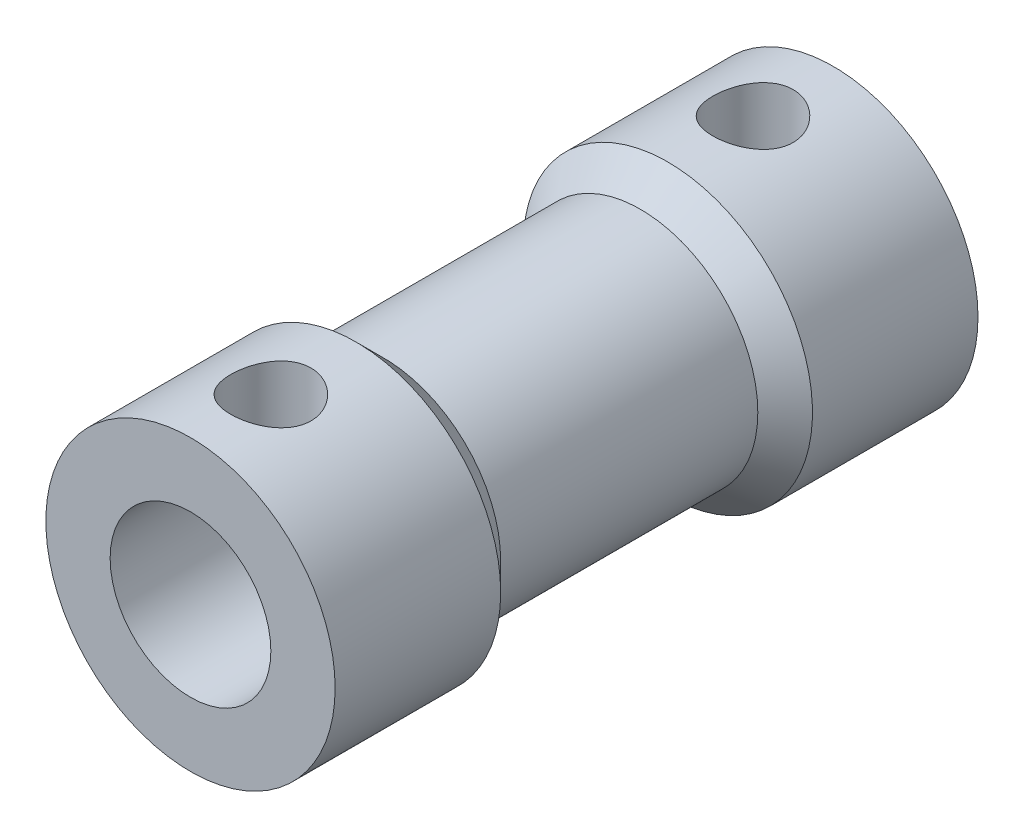
ISO-10303-21;
HEADER;
FILE_DESCRIPTION(('STEP AP214'),'2;1');
FILE_NAME('part.step','',(''),(''),'','','');
FILE_SCHEMA(('AUTOMOTIVE_DESIGN { 1 0 10303 214 1 1 1 1 }'));
ENDSEC;
DATA;
#1=APPLICATION_CONTEXT('core data for automotive mechanical design processes');
#2=APPLICATION_PROTOCOL_DEFINITION('international standard','automotive_design',2000,#1);
#3=PRODUCT_CONTEXT('',#1,'mechanical');
#4=PRODUCT('Part','Part','',(#3));
#5=PRODUCT_RELATED_PRODUCT_CATEGORY('part','',(#4));
#6=PRODUCT_DEFINITION_FORMATION('','',#4);
#7=PRODUCT_DEFINITION_CONTEXT('part definition',#1,'design');
#8=PRODUCT_DEFINITION('design','',#6,#7);
#9=PRODUCT_DEFINITION_SHAPE('','',#8);
#10=(LENGTH_UNIT() NAMED_UNIT(*) SI_UNIT(.MILLI.,.METRE.));
#11=(NAMED_UNIT(*) PLANE_ANGLE_UNIT() SI_UNIT($,.RADIAN.));
#12=(NAMED_UNIT(*) SI_UNIT($,.STERADIAN.) SOLID_ANGLE_UNIT());
#13=UNCERTAINTY_MEASURE_WITH_UNIT(LENGTH_MEASURE(1.E-05),#10,'distance_accuracy_value','');
#14=(GEOMETRIC_REPRESENTATION_CONTEXT(3) GLOBAL_UNCERTAINTY_ASSIGNED_CONTEXT((#13)) GLOBAL_UNIT_ASSIGNED_CONTEXT((#10,
#11,#12)) REPRESENTATION_CONTEXT('',''));
#15=CARTESIAN_POINT('',(0.,0.,0.));
#16=DIRECTION('',(0.,0.,1.));
#17=DIRECTION('',(1.,0.,0.));
#18=AXIS2_PLACEMENT_3D('',#15,#16,#17);
#19=CARTESIAN_POINT('',(0.,0.,5.));
#20=DIRECTION('',(0.,0.,-1.));
#21=DIRECTION('',(-1.,0.,0.));
#22=AXIS2_PLACEMENT_3D('',#19,#20,#21);
#23=CYLINDRICAL_SURFACE('',#22,4.5);
#24=CARTESIAN_POINT('',(0.,4.5,3.74999999999999));
#25=CARTESIAN_POINT('',(-0.0688012508831787,4.49999908016929,3.74999860041476));
#26=CARTESIAN_POINT('',(-0.137617123752666,4.49840674086833,3.7443006801947));
#27=CARTESIAN_POINT('',(-0.273259475994237,4.49220950198236,3.72170427173467));
#28=CARTESIAN_POINT('',(-0.340085103663437,4.48760333149253,3.70480105828627));
#29=CARTESIAN_POINT('',(-0.469769949680299,4.47588565394594,3.66039128058607));
#30=CARTESIAN_POINT('',(-0.532634390095666,4.46877753030964,3.63289903130158));
#31=CARTESIAN_POINT('',(-0.652860695241768,4.45280312581996,3.56814649367313));
#32=CARTESIAN_POINT('',(-0.710222070812293,4.44393668888688,3.53088533808074));
#33=CARTESIAN_POINT('',(-0.819246784715919,4.4251515781749,3.44667056615713));
#34=CARTESIAN_POINT('',(-0.870753112808469,4.41521373623696,3.39951796031245));
#35=CARTESIAN_POINT('',(-0.965238185696333,4.39552607117256,3.2972837228784));
#36=CARTESIAN_POINT('',(-1.00821573084553,4.38577627467018,3.24220097772476));
#37=CARTESIAN_POINT('',(-1.08520808580323,4.36737044294547,3.12439273987068));
#38=CARTESIAN_POINT('',(-1.11903874947837,4.35873847945984,3.06154279155628));
#39=CARTESIAN_POINT('',(-1.17558957131139,4.34382900808304,2.93076808235988));
#40=CARTESIAN_POINT('',(-1.19831197336241,4.33755102474248,2.86284434959184));
#41=CARTESIAN_POINT('',(-1.23144924367955,4.32825883142877,2.72559721114587));
#42=CARTESIAN_POINT('',(-1.24215036904296,4.32516886003199,2.65634817836012));
#43=CARTESIAN_POINT('',(-1.25183427077972,4.32237649384804,2.51697411443717));
#44=CARTESIAN_POINT('',(-1.25081944027302,4.3226734072502,2.4468492651188));
#45=CARTESIAN_POINT('',(-1.23732671337619,4.32655366801454,2.3099777212773));
#46=CARTESIAN_POINT('',(-1.2251990227067,4.33003660668586,2.24319319850379));
#47=CARTESIAN_POINT('',(-1.19038731201904,4.33973517053476,2.11264637140841));
#48=CARTESIAN_POINT('',(-1.16770238457157,4.3459510306134,2.04888432739775));
#49=CARTESIAN_POINT('',(-1.11214373134465,4.36050069775752,1.92529776854472));
#50=CARTESIAN_POINT('',(-1.0791502183699,4.36885918600197,1.86553013318995));
#51=CARTESIAN_POINT('',(-1.00399440679635,4.386739506843,1.75225842440876));
#52=CARTESIAN_POINT('',(-0.961830166290596,4.39626158564316,1.69875568127387));
#53=CARTESIAN_POINT('',(-0.867755610284436,4.41581072126827,1.59753611956359));
#54=CARTESIAN_POINT('',(-0.815552279702351,4.42584370037791,1.55009236512015));
#55=CARTESIAN_POINT('',(-0.703806607201032,4.44498199810829,1.4645742692222));
#56=CARTESIAN_POINT('',(-0.644263925421961,4.45408727373461,1.42650036189753));
#57=CARTESIAN_POINT('',(-0.519083429338111,4.47040839712755,1.36066818436993));
#58=CARTESIAN_POINT('',(-0.453416395747745,4.47761448645532,1.3329628960611));
#59=CARTESIAN_POINT('',(-0.318109988769713,4.48925492501446,1.28906590155864));
#60=CARTESIAN_POINT('',(-0.248471564121129,4.493689933237,1.27287145784344));
#61=CARTESIAN_POINT('',(-0.109526607713141,4.49918736483408,1.25289286322103));
#62=CARTESIAN_POINT('',(-0.0402773058586807,4.5003505382403,1.24873785509284));
#63=CARTESIAN_POINT('',(0.0979299306365669,4.49946480293159,1.25192699829244));
#64=CARTESIAN_POINT('',(0.166887897284518,4.49741625678167,1.25926985164806));
#65=CARTESIAN_POINT('',(0.301206913470859,4.49040265059029,1.28494333411964));
#66=CARTESIAN_POINT('',(0.366611288163866,4.48549337167581,1.30306394505753));
#67=CARTESIAN_POINT('',(0.493443118118719,4.47331829169354,1.3495318676381));
#68=CARTESIAN_POINT('',(0.554870123972379,4.46605222488463,1.37788033256952));
#69=CARTESIAN_POINT('',(0.673420140405413,4.44973740284175,1.4446658780465));
#70=CARTESIAN_POINT('',(0.730427061953538,4.44065471340565,1.48330052432267));
#71=CARTESIAN_POINT('',(0.837277670586996,4.42175477128212,1.56931613580747));
#72=CARTESIAN_POINT('',(0.887119814631371,4.41193736105189,1.61669898006577));
#73=CARTESIAN_POINT('',(0.979812026944947,4.39229842684379,1.72060144387835));
#74=CARTESIAN_POINT('',(1.02239957885382,4.3824860820796,1.77735745155757));
#75=CARTESIAN_POINT('',(1.09745581429007,4.36429693304267,1.89742063787974));
#76=CARTESIAN_POINT('',(1.12992488482463,4.35592007387163,1.9607275658426));
#77=CARTESIAN_POINT('',(1.18358105834153,4.34164798956173,2.09180716988317));
#78=CARTESIAN_POINT('',(1.20483077484782,4.3357390309604,2.15955263775464));
#79=CARTESIAN_POINT('',(1.23557652495356,4.32707876892784,2.29784970941676));
#80=CARTESIAN_POINT('',(1.24507587906572,4.32432657344887,2.36840051463312));
#81=CARTESIAN_POINT('',(1.25184859974321,4.32237038329875,2.50760577949078));
#82=CARTESIAN_POINT('',(1.24954571014581,4.32304340461177,2.57623819001194));
#83=CARTESIAN_POINT('',(1.23377143287258,4.32757137052124,2.71209489379468));
#84=CARTESIAN_POINT('',(1.2203003804941,4.33142621959091,2.77931922926823));
#85=CARTESIAN_POINT('',(1.18282724248614,4.34180718808003,2.90986723391806));
#86=CARTESIAN_POINT('',(1.15892214641117,4.34830866913275,2.97322084264776));
#87=CARTESIAN_POINT('',(1.10133451670734,4.36324916052054,3.09506742250732));
#88=CARTESIAN_POINT('',(1.06765033358687,4.37168849767404,3.15355957148569));
#89=CARTESIAN_POINT('',(0.990206962020966,4.38988810785379,3.26602765282517));
#90=CARTESIAN_POINT('',(0.946162084346261,4.39968178982262,3.31980147668272));
#91=CARTESIAN_POINT('',(0.849781527450658,4.41930831909363,3.41933237205345));
#92=CARTESIAN_POINT('',(0.797443795628186,4.42914117550311,3.46508745289098));
#93=CARTESIAN_POINT('',(0.684460232307877,4.44801839581548,3.54835813657808));
#94=CARTESIAN_POINT('',(0.62364625893217,4.45703841192792,3.58565162331068));
#95=CARTESIAN_POINT('',(0.496361982692838,4.47299974900605,3.64942813928947));
#96=CARTESIAN_POINT('',(0.429895030176722,4.47994229035336,3.67591751858101));
#97=CARTESIAN_POINT('',(0.303145483766698,4.4901607483195,3.71422008073469));
#98=CARTESIAN_POINT('',(0.243364402168739,4.49382245661855,3.72760478759287));
#99=CARTESIAN_POINT('',(0.122392625693408,4.49874234976285,3.74549484582254));
#100=CARTESIAN_POINT('',(0.0612020980194146,4.50000081823468,3.75000124499992));
#101=CARTESIAN_POINT('',(0.,4.5,3.74999999999999));
#102=B_SPLINE_CURVE_WITH_KNOTS('',3,(#24,#25,#26,#27,#28,#29,#30,#31,#32,#33,#34,#35,#36,#37,
#38,#39,#40,#41,#42,#43,#44,#45,#46,#47,#48,#49,#50,#51,#52,#53,#54,#55,#56,#57,#58,#59,#60,#61,
#62,#63,#64,#65,#66,#67,#68,#69,#70,#71,#72,#73,#74,#75,#76,#77,#78,#79,#80,#81,#82,#83,#84,#85,
#86,#87,#88,#89,#90,#91,#92,#93,#94,#95,#96,#97,#98,#99,#100,#101),.UNSPECIFIED.,.T.,.F.,(4,2,2,
2,2,2,2,2,2,2,2,2,2,2,2,2,2,2,2,2,2,2,2,2,2,2,2,2,2,2,2,2,2,2,2,2,2,2,4),(0.,0.206179193099489,
0.412445386147258,0.618433707942851,0.824440322837926,1.03507624325263,1.24574177043995,
1.46037690323671,1.67496866133383,1.88433431939188,2.09365721284143,2.2966023299042,
2.49956489399152,2.70497960040654,2.91043784592673,3.1231949383816,3.33596188658144,
3.54980165635948,3.76359055350005,3.97072010588424,4.17782627748475,4.38102317477484,
4.58424299163036,4.79168948884224,4.99918059600961,5.21305991702848,5.42693105668197,
5.63959564853969,5.85220013017263,6.05722599244304,6.26224569952545,6.46539893556021,
6.66858645848125,6.87821913273767,7.08790377540616,7.30258090584728,7.51713167871714,
7.70055986525025,7.8839664025393),.UNSPECIFIED.);
#103=CARTESIAN_POINT('',(0.,4.5,3.74999999999999));
#104=VERTEX_POINT('',#103);
#105=EDGE_CURVE('E74',#104,#104,#102,.T.);
#106=ORIENTED_EDGE('',*,*,#105,.T.);
#107=EDGE_LOOP('',(#106));
#108=FACE_BOUND('',#107,.T.);
#109=CARTESIAN_POINT('',(0.,0.,5.15000000000001));
#110=DIRECTION('',(0.,0.,-1.));
#111=DIRECTION('',(-1.,0.,0.));
#112=AXIS2_PLACEMENT_3D('',#109,#110,#111);
#113=CIRCLE('',#112,4.5);
#114=CARTESIAN_POINT('',(-4.5,0.,5.15000000000001));
#115=VERTEX_POINT('',#114);
#116=EDGE_CURVE('E93',#115,#115,#113,.T.);
#117=ORIENTED_EDGE('',*,*,#116,.T.);
#118=EDGE_LOOP('',(#117));
#119=FACE_BOUND('',#118,.T.);
#120=CARTESIAN_POINT('',(0.,0.,0.));
#121=DIRECTION('',(0.,0.,1.));
#122=DIRECTION('',(1.,0.,0.));
#123=AXIS2_PLACEMENT_3D('',#120,#121,#122);
#124=CIRCLE('',#123,4.5);
#125=CARTESIAN_POINT('',(4.5,0.,0.));
#126=VERTEX_POINT('',#125);
#127=EDGE_CURVE('E85',#126,#126,#124,.T.);
#128=ORIENTED_EDGE('',*,*,#127,.T.);
#129=EDGE_LOOP('',(#128));
#130=FACE_BOUND('',#129,.T.);
#131=ADVANCED_FACE('F39',(#108,#119,#130),#23,.T.);
#132=CARTESIAN_POINT('',(0.,0.,0.));
#133=DIRECTION('',(0.,0.,1.));
#134=DIRECTION('',(1.,0.,0.));
#135=AXIS2_PLACEMENT_3D('',#132,#133,#134);
#136=PLANE('',#135);
#137=CARTESIAN_POINT('',(0.,0.,0.));
#138=DIRECTION('',(0.,0.,-1.));
#139=DIRECTION('',(-1.,0.,0.));
#140=AXIS2_PLACEMENT_3D('',#137,#138,#139);
#141=CIRCLE('',#140,1.5);
#142=CARTESIAN_POINT('',(-1.5,0.,0.));
#143=VERTEX_POINT('',#142);
#144=EDGE_CURVE('E66',#143,#143,#141,.T.);
#145=ORIENTED_EDGE('',*,*,#144,.F.);
#146=EDGE_LOOP('',(#145));
#147=FACE_BOUND('',#146,.T.);
#148=ORIENTED_EDGE('',*,*,#127,.F.);
#149=EDGE_LOOP('',(#148));
#150=FACE_BOUND('',#149,.T.);
#151=ADVANCED_FACE('F127',(#147,#150),#136,.F.);
#152=CARTESIAN_POINT('',(0.,0.,15.));
#153=DIRECTION('',(0.,0.,-1.));
#154=DIRECTION('',(-1.,0.,0.));
#155=AXIS2_PLACEMENT_3D('',#152,#153,#154);
#156=CYLINDRICAL_SURFACE('',#155,3.65);
#157=CARTESIAN_POINT('',(0.,0.,14.));
#158=DIRECTION('',(0.,0.,1.));
#159=DIRECTION('',(1.,0.,0.));
#160=AXIS2_PLACEMENT_3D('',#157,#158,#159);
#161=CIRCLE('',#160,3.65);
#162=CARTESIAN_POINT('',(3.65,0.,14.));
#163=VERTEX_POINT('',#162);
#164=EDGE_CURVE('E48',#163,#163,#161,.F.);
#165=ORIENTED_EDGE('',*,*,#164,.T.);
#166=EDGE_LOOP('',(#165));
#167=FACE_BOUND('',#166,.T.);
#168=CARTESIAN_POINT('',(0.,0.,6.00000000000002));
#169=DIRECTION('',(0.,0.,1.));
#170=DIRECTION('',(1.,0.,0.));
#171=AXIS2_PLACEMENT_3D('',#168,#169,#170);
#172=CIRCLE('',#171,3.65);
#173=CARTESIAN_POINT('',(3.65,0.,6.00000000000002));
#174=VERTEX_POINT('',#173);
#175=EDGE_CURVE('E89',#174,#174,#172,.T.);
#176=ORIENTED_EDGE('',*,*,#175,.T.);
#177=EDGE_LOOP('',(#176));
#178=FACE_BOUND('',#177,.T.);
#179=ADVANCED_FACE('F100',(#167,#178),#156,.T.);
#180=CARTESIAN_POINT('',(0.,0.,20.));
#181=DIRECTION('',(0.,0.,-1.));
#182=DIRECTION('',(-1.,0.,0.));
#183=AXIS2_PLACEMENT_3D('',#180,#181,#182);
#184=CYLINDRICAL_SURFACE('',#183,4.5);
#185=CARTESIAN_POINT('',(0.,4.5,18.75));
#186=CARTESIAN_POINT('',(-0.0688012508831785,4.49999908016929,18.7499986004148));
#187=CARTESIAN_POINT('',(-0.137617123752666,4.49840674086833,18.7443006801947));
#188=CARTESIAN_POINT('',(-0.273259475994236,4.49220950198236,18.7217042717347));
#189=CARTESIAN_POINT('',(-0.340085103663437,4.48760333149253,18.7048010582863));
#190=CARTESIAN_POINT('',(-0.469769949680299,4.47588565394594,18.6603912805861));
#191=CARTESIAN_POINT('',(-0.532634390095667,4.46877753030964,18.6328990313016));
#192=CARTESIAN_POINT('',(-0.652860695241768,4.45280312581996,18.5681464936731));
#193=CARTESIAN_POINT('',(-0.710222070812293,4.44393668888688,18.5308853380807));
#194=CARTESIAN_POINT('',(-0.819246784715919,4.4251515781749,18.4466705661571));
#195=CARTESIAN_POINT('',(-0.870753112808469,4.41521373623696,18.3995179603125));
#196=CARTESIAN_POINT('',(-0.965238185696333,4.39552607117256,18.2972837228784));
#197=CARTESIAN_POINT('',(-1.00821573084554,4.38577627467018,18.2422009777248));
#198=CARTESIAN_POINT('',(-1.08520808580323,4.36737044294547,18.1243927398707));
#199=CARTESIAN_POINT('',(-1.11903874947837,4.35873847945984,18.0615427915563));
#200=CARTESIAN_POINT('',(-1.17558957131139,4.34382900808304,17.9307680823599));
#201=CARTESIAN_POINT('',(-1.19831197336241,4.33755102474248,17.8628443495918));
#202=CARTESIAN_POINT('',(-1.23144924367955,4.32825883142877,17.7255972111459));
#203=CARTESIAN_POINT('',(-1.24215036904296,4.32516886003198,17.6563481783601));
#204=CARTESIAN_POINT('',(-1.25183427077972,4.32237649384804,17.5169741144372));
#205=CARTESIAN_POINT('',(-1.25081944027302,4.3226734072502,17.4468492651188));
#206=CARTESIAN_POINT('',(-1.23732671337619,4.32655366801454,17.3099777212773));
#207=CARTESIAN_POINT('',(-1.2251990227067,4.33003660668586,17.2431931985038));
#208=CARTESIAN_POINT('',(-1.19038731201904,4.33973517053476,17.1126463714084));
#209=CARTESIAN_POINT('',(-1.16770238457157,4.3459510306134,17.0488843273977));
#210=CARTESIAN_POINT('',(-1.11214373134465,4.36050069775752,16.9252977685447));
#211=CARTESIAN_POINT('',(-1.07915021836991,4.36885918600197,16.86553013319));
#212=CARTESIAN_POINT('',(-1.00399440679635,4.386739506843,16.7522584244088));
#213=CARTESIAN_POINT('',(-0.961830166290598,4.39626158564316,16.6987556812739));
#214=CARTESIAN_POINT('',(-0.867755610284437,4.41581072126827,16.5975361195636));
#215=CARTESIAN_POINT('',(-0.815552279702352,4.42584370037791,16.5500923651202));
#216=CARTESIAN_POINT('',(-0.703806607201032,4.44498199810829,16.4645742692222));
#217=CARTESIAN_POINT('',(-0.644263925421962,4.45408727373461,16.4265003618975));
#218=CARTESIAN_POINT('',(-0.519083429338113,4.47040839712755,16.3606681843699));
#219=CARTESIAN_POINT('',(-0.453416395747746,4.47761448645532,16.3329628960611));
#220=CARTESIAN_POINT('',(-0.318109988769714,4.48925492501446,16.2890659015586));
#221=CARTESIAN_POINT('',(-0.248471564121129,4.493689933237,16.2728714578434));
#222=CARTESIAN_POINT('',(-0.109526607713141,4.49918736483408,16.252892863221));
#223=CARTESIAN_POINT('',(-0.0402773058586806,4.5003505382403,16.2487378550928));
#224=CARTESIAN_POINT('',(0.0979299306365672,4.49946480293159,16.2519269982924));
#225=CARTESIAN_POINT('',(0.166887897284518,4.49741625678167,16.2592698516481));
#226=CARTESIAN_POINT('',(0.301206913470858,4.49040265059029,16.2849433341196));
#227=CARTESIAN_POINT('',(0.366611288163864,4.48549337167581,16.3030639450575));
#228=CARTESIAN_POINT('',(0.493443118118718,4.47331829169354,16.3495318676381));
#229=CARTESIAN_POINT('',(0.554870123972379,4.46605222488463,16.3778803325695));
#230=CARTESIAN_POINT('',(0.673420140405413,4.44973740284175,16.4446658780465));
#231=CARTESIAN_POINT('',(0.730427061953537,4.44065471340565,16.4833005243227));
#232=CARTESIAN_POINT('',(0.837277670586995,4.42175477128212,16.5693161358075));
#233=CARTESIAN_POINT('',(0.887119814631371,4.41193736105189,16.6166989800658));
#234=CARTESIAN_POINT('',(0.979812026944947,4.39229842684379,16.7206014438784));
#235=CARTESIAN_POINT('',(1.02239957885382,4.3824860820796,16.7773574515576));
#236=CARTESIAN_POINT('',(1.09745581429007,4.36429693304267,16.8974206378797));
#237=CARTESIAN_POINT('',(1.12992488482463,4.35592007387163,16.9607275658426));
#238=CARTESIAN_POINT('',(1.18358105834153,4.34164798956173,17.0918071698832));
#239=CARTESIAN_POINT('',(1.20483077484782,4.3357390309604,17.1595526377546));
#240=CARTESIAN_POINT('',(1.23557652495356,4.32707876892784,17.2978497094168));
#241=CARTESIAN_POINT('',(1.24507587906572,4.32432657344887,17.3684005146331));
#242=CARTESIAN_POINT('',(1.25184859974321,4.32237038329875,17.5076057794908));
#243=CARTESIAN_POINT('',(1.24954571014581,4.32304340461177,17.5762381900119));
#244=CARTESIAN_POINT('',(1.23377143287258,4.32757137052124,17.7120948937947));
#245=CARTESIAN_POINT('',(1.2203003804941,4.33142621959091,17.7793192292682));
#246=CARTESIAN_POINT('',(1.18282724248614,4.34180718808003,17.9098672339181));
#247=CARTESIAN_POINT('',(1.15892214641116,4.34830866913275,17.9732208426478));
#248=CARTESIAN_POINT('',(1.10133451670734,4.36324916052054,18.0950674225073));
#249=CARTESIAN_POINT('',(1.06765033358687,4.37168849767404,18.1535595714857));
#250=CARTESIAN_POINT('',(0.990206962020968,4.38988810785379,18.2660276528252));
#251=CARTESIAN_POINT('',(0.946162084346263,4.39968178982262,18.3198014766827));
#252=CARTESIAN_POINT('',(0.84978152745066,4.41930831909363,18.4193323720535));
#253=CARTESIAN_POINT('',(0.797443795628188,4.42914117550311,18.465087452891));
#254=CARTESIAN_POINT('',(0.684460232307879,4.44801839581548,18.5483581365781));
#255=CARTESIAN_POINT('',(0.623646258932172,4.45703841192792,18.5856516233107));
#256=CARTESIAN_POINT('',(0.496361982692839,4.47299974900605,18.6494281392895));
#257=CARTESIAN_POINT('',(0.429895030176723,4.47994229035336,18.675917518581));
#258=CARTESIAN_POINT('',(0.303145483766698,4.4901607483195,18.7142200807347));
#259=CARTESIAN_POINT('',(0.243364402168739,4.49382245661855,18.7276047875929));
#260=CARTESIAN_POINT('',(0.122392625693408,4.49874234976285,18.7454948458225));
#261=CARTESIAN_POINT('',(0.0612020980194147,4.50000081823468,18.7500012449999));
#262=CARTESIAN_POINT('',(0.,4.5,18.75));
#263=B_SPLINE_CURVE_WITH_KNOTS('',3,(#185,#186,#187,#188,#189,#190,#191,#192,#193,#194,#195,
#196,#197,#198,#199,#200,#201,#202,#203,#204,#205,#206,#207,#208,#209,#210,#211,#212,#213,#214,
#215,#216,#217,#218,#219,#220,#221,#222,#223,#224,#225,#226,#227,#228,#229,#230,#231,#232,#233,
#234,#235,#236,#237,#238,#239,#240,#241,#242,#243,#244,#245,#246,#247,#248,#249,#250,#251,#252,
#253,#254,#255,#256,#257,#258,#259,#260,#261,#262),.UNSPECIFIED.,.T.,.F.,(4,2,2,2,2,2,2,2,2,2,2,
2,2,2,2,2,2,2,2,2,2,2,2,2,2,2,2,2,2,2,2,2,2,2,2,2,2,2,4),(0.,0.206179193099489,
0.412445386147258,0.618433707942851,0.824440322837926,1.03507624325264,1.24574177043995,
1.46037690323671,1.67496866133383,1.88433431939188,2.09365721284143,2.29660232990421,
2.49956489399152,2.70497960040654,2.91043784592673,3.1231949383816,3.33596188658144,
3.54980165635947,3.76359055350005,3.97072010588424,4.17782627748475,4.38102317477484,
4.58424299163036,4.79168948884224,4.99918059600961,5.21305991702848,5.42693105668197,
5.63959564853968,5.85220013017264,6.05722599244304,6.26224569952545,6.46539893556021,
6.66858645848125,6.87821913273767,7.08790377540616,7.30258090584728,7.51713167871714,
7.70055986525026,7.8839664025393),.UNSPECIFIED.);
#264=CARTESIAN_POINT('',(0.,4.5,18.75));
#265=VERTEX_POINT('',#264);
#266=EDGE_CURVE('E249',#265,#265,#263,.T.);
#267=ORIENTED_EDGE('',*,*,#266,.T.);
#268=EDGE_LOOP('',(#267));
#269=FACE_BOUND('',#268,.T.);
#270=CARTESIAN_POINT('',(0.,0.,14.85));
#271=DIRECTION('',(0.,0.,1.));
#272=DIRECTION('',(1.,0.,0.));
#273=AXIS2_PLACEMENT_3D('',#270,#271,#272);
#274=CIRCLE('',#273,4.5);
#275=CARTESIAN_POINT('',(4.5,0.,14.85));
#276=VERTEX_POINT('',#275);
#277=EDGE_CURVE('E11',#276,#276,#274,.T.);
#278=ORIENTED_EDGE('',*,*,#277,.T.);
#279=EDGE_LOOP('',(#278));
#280=FACE_BOUND('',#279,.T.);
#281=CARTESIAN_POINT('',(0.,0.,20.));
#282=DIRECTION('',(0.,0.,1.));
#283=DIRECTION('',(1.,0.,0.));
#284=AXIS2_PLACEMENT_3D('',#281,#282,#283);
#285=CIRCLE('',#284,4.5);
#286=CARTESIAN_POINT('',(4.5,0.,20.));
#287=VERTEX_POINT('',#286);
#288=EDGE_CURVE('E81',#287,#287,#285,.T.);
#289=ORIENTED_EDGE('',*,*,#288,.F.);
#290=EDGE_LOOP('',(#289));
#291=FACE_BOUND('',#290,.T.);
#292=ADVANCED_FACE('F109',(#269,#280,#291),#184,.T.);
#293=CARTESIAN_POINT('',(0.,0.,20.));
#294=DIRECTION('',(0.,0.,1.));
#295=DIRECTION('',(1.,0.,0.));
#296=AXIS2_PLACEMENT_3D('',#293,#294,#295);
#297=PLANE('',#296);
#298=CARTESIAN_POINT('',(0.,0.,20.));
#299=DIRECTION('',(0.,0.,1.));
#300=DIRECTION('',(1.,0.,0.));
#301=AXIS2_PLACEMENT_3D('',#298,#299,#300);
#302=CIRCLE('',#301,2.5);
#303=CARTESIAN_POINT('',(2.5,0.,20.));
#304=VERTEX_POINT('',#303);
#305=EDGE_CURVE('E65',#304,#304,#302,.T.);
#306=ORIENTED_EDGE('',*,*,#305,.F.);
#307=EDGE_LOOP('',(#306));
#308=FACE_BOUND('',#307,.T.);
#309=ORIENTED_EDGE('',*,*,#288,.T.);
#310=EDGE_LOOP('',(#309));
#311=FACE_BOUND('',#310,.T.);
#312=ADVANCED_FACE('F112',(#308,#311),#297,.T.);
#313=CARTESIAN_POINT('',(0.,0.,6.00000000000002));
#314=DIRECTION('',(0.,0.,-1.));
#315=DIRECTION('',(-1.,0.,0.));
#316=AXIS2_PLACEMENT_3D('',#313,#314,#315);
#317=CONICAL_SURFACE('',#316,3.65,0.785398163397444);
#318=ORIENTED_EDGE('',*,*,#116,.F.);
#319=EDGE_LOOP('',(#318));
#320=FACE_BOUND('',#319,.T.);
#321=ORIENTED_EDGE('',*,*,#175,.F.);
#322=EDGE_LOOP('',(#321));
#323=FACE_BOUND('',#322,.T.);
#324=ADVANCED_FACE('F106',(#320,#323),#317,.T.);
#325=CARTESIAN_POINT('',(0.,0.,15.));
#326=DIRECTION('',(0.,0.,1.));
#327=DIRECTION('',(1.,0.,0.));
#328=AXIS2_PLACEMENT_3D('',#325,#326,#327);
#329=CONICAL_SURFACE('',#328,4.65000000000002,0.785398163397453);
#330=ORIENTED_EDGE('',*,*,#164,.F.);
#331=EDGE_LOOP('',(#330));
#332=FACE_BOUND('',#331,.T.);
#333=ORIENTED_EDGE('',*,*,#277,.F.);
#334=EDGE_LOOP('',(#333));
#335=FACE_BOUND('',#334,.T.);
#336=ADVANCED_FACE('F41',(#332,#335),#329,.T.);
#337=CARTESIAN_POINT('',(0.,0.,15.));
#338=DIRECTION('',(0.,0.,1.));
#339=DIRECTION('',(1.,0.,0.));
#340=AXIS2_PLACEMENT_3D('',#337,#338,#339);
#341=CONICAL_SURFACE('',#340,2.5,1.02974425867665);
#342=CARTESIAN_POINT('',(0.,0.,13.4978484524311));
#343=VERTEX_POINT('',#342);
#344=VERTEX_LOOP('',#343);
#345=FACE_BOUND('',#344,.T.);
#346=CARTESIAN_POINT('',(0.,0.,15.));
#347=DIRECTION('',(0.,0.,1.));
#348=DIRECTION('',(1.,0.,0.));
#349=AXIS2_PLACEMENT_3D('',#346,#347,#348);
#350=CIRCLE('',#349,2.5);
#351=CARTESIAN_POINT('',(2.5,0.,15.));
#352=VERTEX_POINT('',#351);
#353=EDGE_CURVE('E71',#352,#352,#350,.T.);
#354=ORIENTED_EDGE('',*,*,#353,.T.);
#355=EDGE_LOOP('',(#354));
#356=FACE_BOUND('',#355,.T.);
#357=ADVANCED_FACE('F105',(#345,#356),#341,.F.);
#358=CARTESIAN_POINT('',(0.,0.,20.));
#359=DIRECTION('',(0.,0.,1.));
#360=DIRECTION('',(1.,0.,0.));
#361=AXIS2_PLACEMENT_3D('',#358,#359,#360);
#362=CYLINDRICAL_SURFACE('',#361,2.5);
#363=CARTESIAN_POINT('',(0.,2.5,18.75));
#364=CARTESIAN_POINT('',(0.0657149536912328,2.49999641755189,18.7499958721006));
#365=CARTESIAN_POINT('',(0.13150824962254,2.49738113774397,18.7447874085979));
#366=CARTESIAN_POINT('',(0.26115029408553,2.48717695046745,18.7241838995738));
#367=CARTESIAN_POINT('',(0.324995108391877,2.47957859786229,18.7087695087529));
#368=CARTESIAN_POINT('',(0.448666931100716,2.46020349254139,18.668507739229));
#369=CARTESIAN_POINT('',(0.508508503673973,2.448442989719,18.64369701969));
#370=CARTESIAN_POINT('',(0.623090771008203,2.42182220644723,18.5855367232938));
#371=CARTESIAN_POINT('',(0.677831867487558,2.40696217041913,18.5521878196889));
#372=CARTESIAN_POINT('',(0.784384772202394,2.37445322822571,18.4756034381434));
#373=CARTESIAN_POINT('',(0.835819013902635,2.3566899890942,18.4318919009504));
#374=CARTESIAN_POINT('',(0.930974306083716,2.32074962808431,18.3368481509412));
#375=CARTESIAN_POINT('',(0.974689478883452,2.30257220261294,18.2855101852844));
#376=CARTESIAN_POINT('',(1.05656500056284,2.26623688996684,18.1718958130958));
#377=CARTESIAN_POINT('',(1.09403166943954,2.24818983712665,18.1090798770676));
#378=CARTESIAN_POINT('',(1.15771028361336,2.21607473465401,17.9770408300172));
#379=CARTESIAN_POINT('',(1.18393026870791,2.20200384508737,17.9078223390966));
#380=CARTESIAN_POINT('',(1.22266555273573,2.18072333797261,17.7691686182226));
#381=CARTESIAN_POINT('',(1.23590732135055,2.17315339479642,17.6999944349158));
#382=CARTESIAN_POINT('',(1.25053374163605,2.1647736243566,17.5600264527757));
#383=CARTESIAN_POINT('',(1.25193011046634,2.1639571167911,17.4892343239111));
#384=CARTESIAN_POINT('',(1.24335910896536,2.16888662821561,17.3571424696058));
#385=CARTESIAN_POINT('',(1.23473069942102,2.17385954577517,17.2957199609712));
#386=CARTESIAN_POINT('',(1.20867481132116,2.18845285917313,17.1753476132837));
#387=CARTESIAN_POINT('',(1.19124452987206,2.19807473539721,17.1163985683684));
#388=CARTESIAN_POINT('',(1.1477622254825,2.22109345515927,17.0009635842929));
#389=CARTESIAN_POINT('',(1.12151883389499,2.23457300829998,16.9445670015178));
#390=CARTESIAN_POINT('',(1.061302109585,2.26379255351755,16.8367071342625));
#391=CARTESIAN_POINT('',(1.02732530476558,2.27953355975239,16.7852460804999));
#392=CARTESIAN_POINT('',(0.947582568640979,2.31391447379107,16.681848434071));
#393=CARTESIAN_POINT('',(0.900868072961596,2.33266887795933,16.6306789080298));
#394=CARTESIAN_POINT('',(0.799444473426711,2.36934529125509,16.5365807267614));
#395=CARTESIAN_POINT('',(0.744731570717851,2.38726689948501,16.4936560099577));
#396=CARTESIAN_POINT('',(0.625645632289805,2.42127484103705,16.4153929237128));
#397=CARTESIAN_POINT('',(0.560941989499256,2.43723730202509,16.3804994094428));
#398=CARTESIAN_POINT('',(0.425582769360991,2.46447351401553,16.3223787136962));
#399=CARTESIAN_POINT('',(0.354931970331591,2.47575098679441,16.299142268731));
#400=CARTESIAN_POINT('',(0.215958114575873,2.49155417176795,16.2669057453542));
#401=CARTESIAN_POINT('',(0.147926913185402,2.4965617287664,16.2568859553165));
#402=CARTESIAN_POINT('',(0.0109744999366897,2.50091266823877,16.2481690860819));
#403=CARTESIAN_POINT('',(-0.0579462748373788,2.5002587340164,16.2494666429507));
#404=CARTESIAN_POINT('',(-0.189041214982493,2.49363990316801,16.2627583605234));
#405=CARTESIAN_POINT('',(-0.251324260062443,2.48809057110237,16.2739156659125));
#406=CARTESIAN_POINT('',(-0.373008615377396,2.47277714143524,16.3052975898689));
#407=CARTESIAN_POINT('',(-0.432409607113746,2.46301257917916,16.3255232080667));
#408=CARTESIAN_POINT('',(-0.548610760562082,2.43980314267087,16.3749980830415));
#409=CARTESIAN_POINT('',(-0.605287996257693,2.42626102212424,16.404488812646));
#410=CARTESIAN_POINT('',(-0.713076702123651,2.39679967896386,16.4713844195576));
#411=CARTESIAN_POINT('',(-0.764185787219101,2.38087944457231,16.5087926682418));
#412=CARTESIAN_POINT('',(-0.864709611613314,2.34635276671831,16.5947005316661));
#413=CARTESIAN_POINT('',(-0.913465097280795,2.32763606060552,16.643928585567));
#414=CARTESIAN_POINT('',(-1.00232040139155,2.29077989504843,16.7499064390866));
#415=CARTESIAN_POINT('',(-1.04241423211355,2.27264084226908,16.8066613985205));
#416=CARTESIAN_POINT('',(-1.11463489312212,2.23813990282585,16.9295545677504));
#417=CARTESIAN_POINT('',(-1.14628186984829,2.2219066207934,16.9960140827608));
#418=CARTESIAN_POINT('',(-1.19760353251725,2.19467590460158,17.1343875846157));
#419=CARTESIAN_POINT('',(-1.21729364485946,2.18367172800773,17.2062944081265));
#420=CARTESIAN_POINT('',(-1.24232710931209,2.16951876260834,17.3461377785768));
#421=CARTESIAN_POINT('',(-1.24886624550107,2.16571729325614,17.4137928167863));
#422=CARTESIAN_POINT('',(-1.25086144297598,2.16456693307719,17.5493088339634));
#423=CARTESIAN_POINT('',(-1.24632230828049,2.16721524534441,17.6171697109243));
#424=CARTESIAN_POINT('',(-1.22740765699032,2.17797327562531,17.744354376915));
#425=CARTESIAN_POINT('',(-1.21401039292849,2.18553868102992,17.8038755876805));
#426=CARTESIAN_POINT('',(-1.1789691977808,2.20463770234897,17.9197601492809));
#427=CARTESIAN_POINT('',(-1.15732261394975,2.21617259462095,17.976122477615));
#428=CARTESIAN_POINT('',(-1.10476968162585,2.2428566295566,18.0882810637333));
#429=CARTESIAN_POINT('',(-1.07333892227056,2.25819652995239,18.1437848772871));
#430=CARTESIAN_POINT('',(-1.00268871454579,2.29044164543238,18.2490931702257));
#431=CARTESIAN_POINT('',(-0.963465214048303,2.30734767243153,18.2988946631481));
#432=CARTESIAN_POINT('',(-0.872754158330794,2.34327903949141,18.397677477947));
#433=CARTESIAN_POINT('',(-0.820355528762707,2.36231229139336,18.4458238779524));
#434=CARTESIAN_POINT('',(-0.707693507775342,2.3984719031886,18.5328287292795));
#435=CARTESIAN_POINT('',(-0.647425904070974,2.4155972326005,18.5716821742829));
#436=CARTESIAN_POINT('',(-0.519914496024926,2.44622511981379,18.6390454534528));
#437=CARTESIAN_POINT('',(-0.452624379918261,2.45970120703636,18.6674802117643));
#438=CARTESIAN_POINT('',(-0.313427626617732,2.48126676704332,18.7122602098987));
#439=CARTESIAN_POINT('',(-0.24153474952895,2.48937154216165,18.728639808537));
#440=CARTESIAN_POINT('',(-0.140752433104224,2.49619327387079,18.7423717638448));
#441=CARTESIAN_POINT('',(-0.112702349299368,2.49761706674002,18.7452283010795));
#442=CARTESIAN_POINT('',(-0.0564396647589445,2.49952121222331,18.749043331896));
#443=CARTESIAN_POINT('',(-0.0282270595592254,2.50000153879704,18.750001773089));
#444=CARTESIAN_POINT('',(0.,2.5,18.75));
#445=B_SPLINE_CURVE_WITH_KNOTS('',3,(#363,#364,#365,#366,#367,#368,#369,#370,#371,#372,#373,
#374,#375,#376,#377,#378,#379,#380,#381,#382,#383,#384,#385,#386,#387,#388,#389,#390,#391,#392,
#393,#394,#395,#396,#397,#398,#399,#400,#401,#402,#403,#404,#405,#406,#407,#408,#409,#410,#411,
#412,#413,#414,#415,#416,#417,#418,#419,#420,#421,#422,#423,#424,#425,#426,#427,#428,#429,#430,
#431,#432,#433,#434,#435,#436,#437,#438,#439,#440,#441,#442,#443,#444),.UNSPECIFIED.,.T.,.F.,(4,
2,2,2,2,2,2,2,2,2,2,2,2,2,2,2,2,2,2,2,2,2,2,2,2,2,2,2,2,2,2,2,2,2,2,2,2,2,2,2,4),(0.,
0.197030321775365,0.394435187136495,0.59107769436537,0.787704700726956,0.996227198397603,
1.20490779706754,1.4297715803844,1.6544743487285,1.86572515175286,2.07676696661275,
2.2625714051165,2.44843504907097,2.63862800210608,2.82890651575276,3.04331176667347,
3.25781918248356,3.48228777768049,3.70657771140348,3.9122911308918,4.11790705639343,
4.3075863313265,4.49728652038662,4.69241070034871,4.88761813435422,5.10199513305521,
5.31651985769287,5.5414335269959,5.7660563992597,5.96911634372964,6.17208824825004,
6.35572412805225,6.53941910979594,6.73545570969514,6.93159451423694,7.1515655344062,
7.37165479220712,7.59330017078653,7.81431135781159,7.89894100172118,7.98357298143554),.UNSPECIFIED.);
#446=CARTESIAN_POINT('',(0.,2.5,18.75));
#447=VERTEX_POINT('',#446);
#448=EDGE_CURVE('E256',#447,#447,#445,.T.);
#449=ORIENTED_EDGE('',*,*,#448,.T.);
#450=EDGE_LOOP('',(#449));
#451=FACE_BOUND('',#450,.T.);
#452=ORIENTED_EDGE('',*,*,#353,.F.);
#453=EDGE_LOOP('',(#452));
#454=FACE_BOUND('',#453,.T.);
#455=ORIENTED_EDGE('',*,*,#305,.T.);
#456=EDGE_LOOP('',(#455));
#457=FACE_BOUND('',#456,.T.);
#458=ADVANCED_FACE('F58',(#451,#454,#457),#362,.F.);
#459=CARTESIAN_POINT('',(0.,0.,5.));
#460=DIRECTION('',(0.,0.,-1.));
#461=DIRECTION('',(-1.,0.,0.));
#462=AXIS2_PLACEMENT_3D('',#459,#460,#461);
#463=CONICAL_SURFACE('',#462,1.5,1.02974425867665);
#464=CARTESIAN_POINT('',(0.,0.,5.90129092854134));
#465=VERTEX_POINT('',#464);
#466=VERTEX_LOOP('',#465);
#467=FACE_BOUND('',#466,.T.);
#468=CARTESIAN_POINT('',(0.,0.,5.));
#469=DIRECTION('',(0.,0.,-1.));
#470=DIRECTION('',(-1.,0.,0.));
#471=AXIS2_PLACEMENT_3D('',#468,#469,#470);
#472=CIRCLE('',#471,1.5);
#473=CARTESIAN_POINT('',(-1.5,0.,5.));
#474=VERTEX_POINT('',#473);
#475=EDGE_CURVE('E62',#474,#474,#472,.T.);
#476=ORIENTED_EDGE('',*,*,#475,.T.);
#477=EDGE_LOOP('',(#476));
#478=FACE_BOUND('',#477,.T.);
#479=ADVANCED_FACE('F54',(#467,#478),#463,.F.);
#480=CARTESIAN_POINT('',(0.,0.,0.));
#481=DIRECTION('',(0.,0.,-1.));
#482=DIRECTION('',(-1.,0.,0.));
#483=AXIS2_PLACEMENT_3D('',#480,#481,#482);
#484=CYLINDRICAL_SURFACE('',#483,1.5);
#485=CARTESIAN_POINT('',(0.,1.5,3.74999999999999));
#486=CARTESIAN_POINT('',(0.0593787688504966,1.49999760600508,3.74999755162013));
#487=CARTESIAN_POINT('',(0.118775657075963,1.49644333306022,3.74573873608633));
#488=CARTESIAN_POINT('',(0.235591229710262,1.48255383426958,3.72901865029432));
#489=CARTESIAN_POINT('',(0.293008415894372,1.47221358646977,3.71655130529972));
#490=CARTESIAN_POINT('',(0.40391503473732,1.44571337985919,3.68434389929648));
#491=CARTESIAN_POINT('',(0.457425697494255,1.42958821794707,3.66464730700095));
#492=CARTESIAN_POINT('',(0.559920458095058,1.39264614580735,3.6189916319036));
#493=CARTESIAN_POINT('',(0.608903018804497,1.37182765054183,3.59303043320278));
#494=CARTESIAN_POINT('',(0.718951202770198,1.31836960624056,3.52527232994862));
#495=CARTESIAN_POINT('',(0.777846384687487,1.28419684309181,3.48116142459714));
#496=CARTESIAN_POINT('',(0.886006690341643,1.21211904371339,3.38474132022427));
#497=CARTESIAN_POINT('',(0.935244207719102,1.17420376089562,3.3324093677746));
#498=CARTESIAN_POINT('',(1.02476981505215,1.0969954782186,3.21947566655175));
#499=CARTESIAN_POINT('',(1.06487540714461,1.05768996729307,3.1587387889954));
#500=CARTESIAN_POINT('',(1.13460946975338,0.982473378237864,3.0296493277532));
#501=CARTESIAN_POINT('',(1.16426870455502,0.946552565043531,2.96131989924883));
#502=CARTESIAN_POINT('',(1.20096809386343,0.898966702929837,2.84915232182338));
#503=CARTESIAN_POINT('',(1.21216917699589,0.88368345377962,2.80823415135927));
#504=CARTESIAN_POINT('',(1.23050643018312,0.857964009892276,2.72405890858106));
#505=CARTESIAN_POINT('',(1.23765246650146,0.847516062002454,2.68080779601689));
#506=CARTESIAN_POINT('',(1.24740539483338,0.833105139761362,2.59211619323376));
#507=CARTESIAN_POINT('',(1.24995600781897,0.829222605301807,2.5466554691685));
#508=CARTESIAN_POINT('',(1.25004286433053,0.829091490172112,2.45571924480199));
#509=CARTESIAN_POINT('',(1.24757904212978,0.832843009565346,2.41024374431485));
#510=CARTESIAN_POINT('',(1.23752620102326,0.847707888605663,2.31723645016103));
#511=CARTESIAN_POINT('',(1.22952745139609,0.859408312456989,2.2698487974024));
#512=CARTESIAN_POINT('',(1.20871318849992,0.888442533165828,2.1778988541605));
#513=CARTESIAN_POINT('',(1.19588169148343,0.905794997455975,2.13334651912333));
#514=CARTESIAN_POINT('',(1.15722563130128,0.955139134708265,2.02189560230472));
#515=CARTESIAN_POINT('',(1.1281992385967,0.98973454174227,1.95728511979403));
#516=CARTESIAN_POINT('',(1.06071724104507,1.06176362696161,1.83497126098836));
#517=CARTESIAN_POINT('',(1.02224478491079,1.0992022940155,1.77728050595929));
#518=CARTESIAN_POINT('',(0.933838554257824,1.17538495988872,1.66587958721672));
#519=CARTESIAN_POINT('',(0.883411408236019,1.214095109928,1.61253430361171));
#520=CARTESIAN_POINT('',(0.772419565040682,1.28754911495832,1.51444036956109));
#521=CARTESIAN_POINT('',(0.711877274428577,1.32230145708775,1.46967317783161));
#522=CARTESIAN_POINT('',(0.597056314168984,1.37714389382959,1.4002931891689));
#523=CARTESIAN_POINT('',(0.544863772530689,1.3987415689319,1.37342871405698));
#524=CARTESIAN_POINT('',(0.435535617240911,1.43653920142358,1.3268284643236));
#525=CARTESIAN_POINT('',(0.378403116632042,1.45274252741888,1.30708824017554));
#526=CARTESIAN_POINT('',(0.25997718059176,1.47854912184039,1.27579141940212));
#527=CARTESIAN_POINT('',(0.198655468325025,1.4881013901647,1.26429803928538));
#528=CARTESIAN_POINT('',(0.0742799817039901,1.49945718724959,1.25064537143071));
#529=CARTESIAN_POINT('',(0.0112273946835277,1.50126590049908,1.24847983847781));
#530=CARTESIAN_POINT('',(-0.106655102299895,1.49722498729296,1.25333122508869));
#531=CARTESIAN_POINT('',(-0.161565285324154,1.4922667351792,1.25927932977239));
#532=CARTESIAN_POINT('',(-0.269322467292313,1.47662796570524,1.27813346468971));
#533=CARTESIAN_POINT('',(-0.322169217931426,1.46594676193198,1.29104032956088));
#534=CARTESIAN_POINT('',(-0.425282807428047,1.43944754113184,1.32331173451291));
#535=CARTESIAN_POINT('',(-0.475505558665486,1.42356257517913,1.34276053215235));
#536=CARTESIAN_POINT('',(-0.571829286856185,1.38768087304245,1.3871976786873));
#537=CARTESIAN_POINT('',(-0.61792873132881,1.36768261713726,1.41218807528312));
#538=CARTESIAN_POINT('',(-0.725338376691829,1.31487441147003,1.47921664146491));
#539=CARTESIAN_POINT('',(-0.784177111169762,1.28034513521539,1.52386964637634));
#540=CARTESIAN_POINT('',(-0.892139643516483,1.20761833212684,1.62141682602767));
#541=CARTESIAN_POINT('',(-0.941232285418767,1.16940960315471,1.67433649377557));
#542=CARTESIAN_POINT('',(-1.03033901299863,1.09176431315107,1.78848795246967));
#543=CARTESIAN_POINT('',(-1.07017375330095,1.05231803111602,1.84985223063407));
#544=CARTESIAN_POINT('',(-1.13922410535013,0.977105860325161,1.98029258014808));
#545=CARTESIAN_POINT('',(-1.1684744432838,0.941328217251959,2.04934244271886));
#546=CARTESIAN_POINT('',(-1.20418713962594,0.894635188877054,2.16214898470547));
#547=CARTESIAN_POINT('',(-1.21494166451886,0.879855535045267,2.2029209384313));
#548=CARTESIAN_POINT('',(-1.23241118575506,0.855213348293514,2.28672227341193));
#549=CARTESIAN_POINT('',(-1.23913627036994,0.845338546087727,2.32974572127118));
#550=CARTESIAN_POINT('',(-1.24808646608226,0.832077095797264,2.41781988033101));
#551=CARTESIAN_POINT('',(-1.25025897513146,0.828766313990404,2.46288820694847));
#552=CARTESIAN_POINT('',(-1.24969100631609,0.829621484389414,2.55292606417596));
#553=CARTESIAN_POINT('',(-1.24694923297195,0.833789408096113,2.59789556560518));
#554=CARTESIAN_POINT('',(-1.23632620681834,0.849464182651587,2.69083749596599));
#555=CARTESIAN_POINT('',(-1.2279286145655,0.861705472805844,2.73861956187497));
#556=CARTESIAN_POINT('',(-1.20625214805456,0.89179502709844,2.83126120670842));
#557=CARTESIAN_POINT('',(-1.19295712996403,0.909661806430635,2.87611053579845));
#558=CARTESIAN_POINT('',(-1.1529905403742,0.96029338107959,2.98834179815002));
#559=CARTESIAN_POINT('',(-1.12305667484072,0.995623570298272,3.05338132903312));
#560=CARTESIAN_POINT('',(-1.05354944095063,1.06893108151572,3.17640963589643));
#561=CARTESIAN_POINT('',(-1.01395911755889,1.1069129747866,3.23438573828661));
#562=CARTESIAN_POINT('',(-0.923157683511314,1.18384825527247,3.34599075337966));
#563=CARTESIAN_POINT('',(-0.871472234833862,1.2227580597596,3.39926748450177));
#564=CARTESIAN_POINT('',(-0.757765343279691,1.29628639574611,3.49693530462562));
#565=CARTESIAN_POINT('',(-0.695767358080659,1.33091436227144,3.54134606754817));
#566=CARTESIAN_POINT('',(-0.579278005881024,1.38471086227028,3.60915651690692));
#567=CARTESIAN_POINT('',(-0.526999500141233,1.40556069252781,3.63501910031227));
#568=CARTESIAN_POINT('',(-0.417719782772103,1.44180748060128,3.67960948970956));
#569=CARTESIAN_POINT('',(-0.360724986716853,1.45721170036656,3.69834680009581));
#570=CARTESIAN_POINT('',(-0.253310041564187,1.47929369322443,3.72509419634338));
#571=CARTESIAN_POINT('',(-0.203422739425027,1.48701070119817,3.73438755201361));
#572=CARTESIAN_POINT('',(-0.102361357783524,1.49736462476332,3.74684119321787));
#573=CARTESIAN_POINT('',(-0.051187411404352,1.50000206374105,3.75000211062353));
#574=CARTESIAN_POINT('',(0.,1.5,3.74999999999999));
#575=B_SPLINE_CURVE_WITH_KNOTS('',3,(#485,#486,#487,#488,#489,#490,#491,#492,#493,#494,#495,
#496,#497,#498,#499,#500,#501,#502,#503,#504,#505,#506,#507,#508,#509,#510,#511,#512,#513,#514,
#515,#516,#517,#518,#519,#520,#521,#522,#523,#524,#525,#526,#527,#528,#529,#530,#531,#532,#533,
#534,#535,#536,#537,#538,#539,#540,#541,#542,#543,#544,#545,#546,#547,#548,#549,#550,#551,#552,
#553,#554,#555,#556,#557,#558,#559,#560,#561,#562,#563,#564,#565,#566,#567,#568,#569,#570,#571,
#572,#573,#574),.UNSPECIFIED.,.T.,.F.,(4,2,2,2,2,2,2,2,2,2,2,2,2,2,2,2,2,2,2,2,2,2,2,2,2,2,2,2,
2,2,2,2,2,2,2,2,2,2,2,2,2,2,2,2,4),(0.,0.177920638407556,0.355973095513479,0.532972026797752,
0.710030824150575,0.952125893800627,1.19490321558387,1.4421737640865,1.68870989486939,
1.82361318167479,1.95818681458037,2.0943976161209,2.23061020305626,2.37816635242836,
2.52621487430063,2.76143398970636,2.9970758121581,3.24501566810455,3.49241341014753,
3.67933989515107,3.86614943036557,4.05437609196179,4.24247671173499,4.40804641875282,
4.57363598871254,4.74144560410122,4.90931733118535,5.15261089108599,5.39667010414655,
5.64512295341125,5.89275310452976,6.02641745468302,6.15974574356461,6.29460624678871,
6.42950230652134,6.57876724728638,6.72852869227185,6.96677041328345,7.20543349464892,
7.45579032127003,7.70558526561252,7.89070171070693,8.07557035570182,8.22896247938914,
8.38233879708315),.UNSPECIFIED.);
#576=CARTESIAN_POINT('',(0.,1.5,3.74999999999999));
#577=VERTEX_POINT('',#576);
#578=EDGE_CURVE('E145',#577,#577,#575,.T.);
#579=ORIENTED_EDGE('',*,*,#578,.T.);
#580=EDGE_LOOP('',(#579));
#581=FACE_BOUND('',#580,.T.);
#582=ORIENTED_EDGE('',*,*,#475,.F.);
#583=EDGE_LOOP('',(#582));
#584=FACE_BOUND('',#583,.T.);
#585=ORIENTED_EDGE('',*,*,#144,.T.);
#586=EDGE_LOOP('',(#585));
#587=FACE_BOUND('',#586,.T.);
#588=ADVANCED_FACE('F57',(#581,#584,#587),#484,.F.);
#589=CARTESIAN_POINT('',(0.,4.5,2.5));
#590=DIRECTION('',(0.,1.,0.));
#591=DIRECTION('',(0.,0.,1.));
#592=AXIS2_PLACEMENT_3D('',#589,#590,#591);
#593=CYLINDRICAL_SURFACE('',#592,1.24999999999999);
#594=ORIENTED_EDGE('',*,*,#578,.F.);
#595=EDGE_LOOP('',(#594));
#596=FACE_BOUND('',#595,.T.);
#597=ORIENTED_EDGE('',*,*,#105,.F.);
#598=EDGE_LOOP('',(#597));
#599=FACE_BOUND('',#598,.T.);
#600=ADVANCED_FACE('F151',(#596,#599),#593,.F.);
#601=CARTESIAN_POINT('',(0.,4.5,17.5));
#602=DIRECTION('',(0.,1.,0.));
#603=DIRECTION('',(0.,0.,1.));
#604=AXIS2_PLACEMENT_3D('',#601,#602,#603);
#605=CYLINDRICAL_SURFACE('',#604,1.24999999999999);
#606=ORIENTED_EDGE('',*,*,#448,.F.);
#607=EDGE_LOOP('',(#606));
#608=FACE_BOUND('',#607,.T.);
#609=ORIENTED_EDGE('',*,*,#266,.F.);
#610=EDGE_LOOP('',(#609));
#611=FACE_BOUND('',#610,.T.);
#612=ADVANCED_FACE('F155',(#608,#611),#605,.F.);
#613=CLOSED_SHELL('',(#131,#151,#179,#292,#312,#324,#336,#357,#458,#479,#588,#600,#612));
#614=MANIFOLD_SOLID_BREP('B2',#613);
#615=ADVANCED_BREP_SHAPE_REPRESENTATION('',(#18,#614),#14);
#616=SHAPE_DEFINITION_REPRESENTATION(#9,#615);
ENDSEC;
END-ISO-10303-21;
